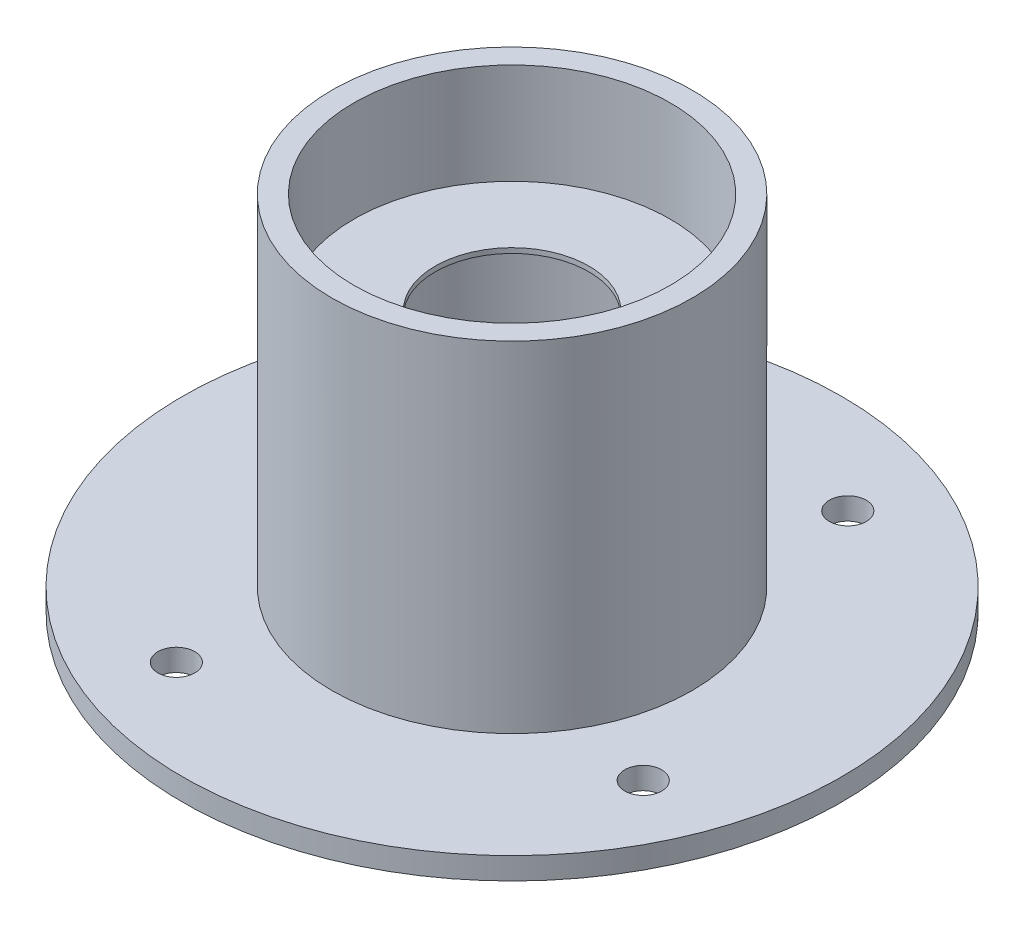
ISO-10303-21;
HEADER;
FILE_DESCRIPTION(('STEP AP214'),'2;1');
FILE_NAME('part.step','',(''),(''),'','','');
FILE_SCHEMA(('AUTOMOTIVE_DESIGN { 1 0 10303 214 1 1 1 1 }'));
ENDSEC;
DATA;
#1=APPLICATION_CONTEXT('core data for automotive mechanical design processes');
#2=APPLICATION_PROTOCOL_DEFINITION('international standard','automotive_design',2000,#1);
#3=PRODUCT_CONTEXT('',#1,'mechanical');
#4=PRODUCT('Part','Part','',(#3));
#5=PRODUCT_RELATED_PRODUCT_CATEGORY('part','',(#4));
#6=PRODUCT_DEFINITION_FORMATION('','',#4);
#7=PRODUCT_DEFINITION_CONTEXT('part definition',#1,'design');
#8=PRODUCT_DEFINITION('design','',#6,#7);
#9=PRODUCT_DEFINITION_SHAPE('','',#8);
#10=(LENGTH_UNIT() NAMED_UNIT(*) SI_UNIT(.MILLI.,.METRE.));
#11=(NAMED_UNIT(*) PLANE_ANGLE_UNIT() SI_UNIT($,.RADIAN.));
#12=(NAMED_UNIT(*) SI_UNIT($,.STERADIAN.) SOLID_ANGLE_UNIT());
#13=UNCERTAINTY_MEASURE_WITH_UNIT(LENGTH_MEASURE(1.E-05),#10,'distance_accuracy_value','');
#14=(GEOMETRIC_REPRESENTATION_CONTEXT(3) GLOBAL_UNCERTAINTY_ASSIGNED_CONTEXT((#13)) GLOBAL_UNIT_ASSIGNED_CONTEXT((#10,
#11,#12)) REPRESENTATION_CONTEXT('',''));
#15=CARTESIAN_POINT('',(0.,0.,0.));
#16=DIRECTION('',(0.,0.,1.));
#17=DIRECTION('',(1.,0.,0.));
#18=AXIS2_PLACEMENT_3D('',#15,#16,#17);
#19=CARTESIAN_POINT('',(0.,7.71111716528533,0.));
#20=DIRECTION('',(0.,1.,0.));
#21=DIRECTION('',(0.,0.,1.));
#22=AXIS2_PLACEMENT_3D('',#19,#20,#21);
#23=CYLINDRICAL_SURFACE('',#22,41.);
#24=CARTESIAN_POINT('',(0.,-53.85,0.));
#25=DIRECTION('',(0.,-1.,0.));
#26=DIRECTION('',(0.,0.,-1.));
#27=AXIS2_PLACEMENT_3D('',#24,#25,#26);
#28=CIRCLE('',#27,41.);
#29=CARTESIAN_POINT('',(0.,-53.85,-41.));
#30=VERTEX_POINT('',#29);
#31=EDGE_CURVE('E61',#30,#30,#28,.T.);
#32=ORIENTED_EDGE('',*,*,#31,.F.);
#33=EDGE_LOOP('',(#32));
#34=FACE_BOUND('',#33,.T.);
#35=CARTESIAN_POINT('',(0.,23.5,0.));
#36=DIRECTION('',(0.,1.,0.));
#37=DIRECTION('',(0.,0.,1.));
#38=AXIS2_PLACEMENT_3D('',#35,#36,#37);
#39=CIRCLE('',#38,41.);
#40=CARTESIAN_POINT('',(0.,23.5,41.));
#41=VERTEX_POINT('',#40);
#42=EDGE_CURVE('E65',#41,#41,#39,.T.);
#43=ORIENTED_EDGE('',*,*,#42,.F.);
#44=EDGE_LOOP('',(#43));
#45=FACE_BOUND('',#44,.T.);
#46=ADVANCED_FACE('F37',(#34,#45),#23,.T.);
#47=CARTESIAN_POINT('',(0.,7.71111716528533,0.));
#48=DIRECTION('',(0.,1.,0.));
#49=DIRECTION('',(0.,0.,1.));
#50=AXIS2_PLACEMENT_3D('',#47,#48,#49);
#51=CYLINDRICAL_SURFACE('',#50,36.);
#52=CARTESIAN_POINT('',(0.,0.57,0.));
#53=DIRECTION('',(0.,1.,0.));
#54=DIRECTION('',(0.,0.,1.));
#55=AXIS2_PLACEMENT_3D('',#52,#53,#54);
#56=CIRCLE('',#55,36.);
#57=CARTESIAN_POINT('',(0.,0.57,36.));
#58=VERTEX_POINT('',#57);
#59=EDGE_CURVE('E55',#58,#58,#56,.T.);
#60=ORIENTED_EDGE('',*,*,#59,.F.);
#61=EDGE_LOOP('',(#60));
#62=FACE_BOUND('',#61,.T.);
#63=CARTESIAN_POINT('',(0.,23.5,0.));
#64=DIRECTION('',(0.,1.,0.));
#65=DIRECTION('',(0.,0.,1.));
#66=AXIS2_PLACEMENT_3D('',#63,#64,#65);
#67=CIRCLE('',#66,36.);
#68=CARTESIAN_POINT('',(0.,23.5,36.));
#69=VERTEX_POINT('',#68);
#70=EDGE_CURVE('E69',#69,#69,#67,.T.);
#71=ORIENTED_EDGE('',*,*,#70,.T.);
#72=EDGE_LOOP('',(#71));
#73=FACE_BOUND('',#72,.T.);
#74=ADVANCED_FACE('F156',(#62,#73),#51,.F.);
#75=CARTESIAN_POINT('',(-36.,0.57,0.));
#76=DIRECTION('',(0.,1.,0.));
#77=DIRECTION('',(0.,0.,1.));
#78=AXIS2_PLACEMENT_3D('',#75,#76,#77);
#79=PLANE('',#78);
#80=ORIENTED_EDGE('',*,*,#59,.T.);
#81=EDGE_LOOP('',(#80));
#82=FACE_BOUND('',#81,.T.);
#83=CARTESIAN_POINT('',(0.,0.57,0.));
#84=DIRECTION('',(0.,1.,0.));
#85=DIRECTION('',(0.,0.,1.));
#86=AXIS2_PLACEMENT_3D('',#83,#84,#85);
#87=CIRCLE('',#86,17.5);
#88=CARTESIAN_POINT('',(0.,0.57,17.5));
#89=VERTEX_POINT('',#88);
#90=EDGE_CURVE('E10',#89,#89,#87,.T.);
#91=ORIENTED_EDGE('',*,*,#90,.F.);
#92=EDGE_LOOP('',(#91));
#93=FACE_BOUND('',#92,.T.);
#94=ADVANCED_FACE('F39',(#82,#93),#79,.T.);
#95=CARTESIAN_POINT('',(0.,7.71111716528533,0.));
#96=DIRECTION('',(0.,1.,0.));
#97=DIRECTION('',(0.,0.,1.));
#98=AXIS2_PLACEMENT_3D('',#95,#96,#97);
#99=CYLINDRICAL_SURFACE('',#98,17.5);
#100=ORIENTED_EDGE('',*,*,#90,.T.);
#101=EDGE_LOOP('',(#100));
#102=FACE_BOUND('',#101,.T.);
#103=CARTESIAN_POINT('',(0.,-0.57,0.));
#104=DIRECTION('',(0.,1.,0.));
#105=DIRECTION('',(0.,0.,1.));
#106=AXIS2_PLACEMENT_3D('',#103,#104,#105);
#107=CIRCLE('',#106,17.5);
#108=CARTESIAN_POINT('',(0.,-0.57,17.5));
#109=VERTEX_POINT('',#108);
#110=EDGE_CURVE('E45',#109,#109,#107,.T.);
#111=ORIENTED_EDGE('',*,*,#110,.F.);
#112=EDGE_LOOP('',(#111));
#113=FACE_BOUND('',#112,.T.);
#114=ADVANCED_FACE('F173',(#102,#113),#99,.F.);
#115=CARTESIAN_POINT('',(-17.5,-0.57,0.));
#116=DIRECTION('',(0.,-1.,0.));
#117=DIRECTION('',(0.,0.,-1.));
#118=AXIS2_PLACEMENT_3D('',#115,#116,#117);
#119=PLANE('',#118);
#120=ORIENTED_EDGE('',*,*,#110,.T.);
#121=EDGE_LOOP('',(#120));
#122=FACE_BOUND('',#121,.T.);
#123=CARTESIAN_POINT('',(0.,-0.57,0.));
#124=DIRECTION('',(0.,1.,0.));
#125=DIRECTION('',(0.,0.,1.));
#126=AXIS2_PLACEMENT_3D('',#123,#124,#125);
#127=CIRCLE('',#126,36.);
#128=CARTESIAN_POINT('',(0.,-0.57,36.));
#129=VERTEX_POINT('',#128);
#130=EDGE_CURVE('E50',#129,#129,#127,.T.);
#131=ORIENTED_EDGE('',*,*,#130,.F.);
#132=EDGE_LOOP('',(#131));
#133=FACE_BOUND('',#132,.T.);
#134=ADVANCED_FACE('F170',(#122,#133),#119,.T.);
#135=CARTESIAN_POINT('',(0.,7.71111716528533,0.));
#136=DIRECTION('',(0.,1.,0.));
#137=DIRECTION('',(0.,0.,1.));
#138=AXIS2_PLACEMENT_3D('',#135,#136,#137);
#139=CYLINDRICAL_SURFACE('',#138,36.);
#140=ORIENTED_EDGE('',*,*,#130,.T.);
#141=EDGE_LOOP('',(#140));
#142=FACE_BOUND('',#141,.T.);
#143=CARTESIAN_POINT('',(0.,-58.85,0.));
#144=DIRECTION('',(0.,-1.,0.));
#145=DIRECTION('',(0.,0.,-1.));
#146=AXIS2_PLACEMENT_3D('',#143,#144,#145);
#147=CIRCLE('',#146,36.);
#148=CARTESIAN_POINT('',(0.,-58.85,-36.));
#149=VERTEX_POINT('',#148);
#150=EDGE_CURVE('E78',#149,#149,#147,.T.);
#151=ORIENTED_EDGE('',*,*,#150,.T.);
#152=EDGE_LOOP('',(#151));
#153=FACE_BOUND('',#152,.T.);
#154=ADVANCED_FACE('F166',(#142,#153),#139,.F.);
#155=CARTESIAN_POINT('',(0.,23.5,0.));
#156=DIRECTION('',(0.,1.,0.));
#157=DIRECTION('',(0.,0.,1.));
#158=AXIS2_PLACEMENT_3D('',#155,#156,#157);
#159=PLANE('',#158);
#160=ORIENTED_EDGE('',*,*,#70,.F.);
#161=EDGE_LOOP('',(#160));
#162=FACE_BOUND('',#161,.T.);
#163=ORIENTED_EDGE('',*,*,#42,.T.);
#164=EDGE_LOOP('',(#163));
#165=FACE_BOUND('',#164,.T.);
#166=ADVANCED_FACE('F169',(#162,#165),#159,.T.);
#167=CARTESIAN_POINT('',(0.,-58.85,0.));
#168=DIRECTION('',(0.,-1.,0.));
#169=DIRECTION('',(0.,0.,-1.));
#170=AXIS2_PLACEMENT_3D('',#167,#168,#169);
#171=PLANE('',#170);
#172=CARTESIAN_POINT('',(-23.2775301449336,-58.85,53.1239737816337));
#173=DIRECTION('',(0.,1.,0.));
#174=DIRECTION('',(-1.,0.,0.));
#175=AXIS2_PLACEMENT_3D('',#172,#173,#174);
#176=CIRCLE('',#175,4.2);
#177=CARTESIAN_POINT('',(-27.4775301449336,-58.85,53.1239737816337));
#178=VERTEX_POINT('',#177);
#179=EDGE_CURVE('E107',#178,#178,#176,.T.);
#180=ORIENTED_EDGE('',*,*,#179,.T.);
#181=EDGE_LOOP('',(#180));
#182=FACE_BOUND('',#181,.T.);
#183=CARTESIAN_POINT('',(-53.1239737816338,-58.85,-23.2775301449335));
#184=DIRECTION('',(0.,1.,0.));
#185=DIRECTION('',(0.,0.,-1.));
#186=AXIS2_PLACEMENT_3D('',#183,#184,#185);
#187=CIRCLE('',#186,4.2);
#188=CARTESIAN_POINT('',(-53.1239737816338,-58.85,-27.4775301449335));
#189=VERTEX_POINT('',#188);
#190=EDGE_CURVE('E98',#189,#189,#187,.T.);
#191=ORIENTED_EDGE('',*,*,#190,.T.);
#192=EDGE_LOOP('',(#191));
#193=FACE_BOUND('',#192,.T.);
#194=CARTESIAN_POINT('',(23.277530144934,-58.85,-53.1239737816335));
#195=DIRECTION('',(0.,1.,0.));
#196=DIRECTION('',(1.,0.,0.));
#197=AXIS2_PLACEMENT_3D('',#194,#195,#196);
#198=CIRCLE('',#197,4.2);
#199=CARTESIAN_POINT('',(27.477530144934,-58.85,-53.1239737816335));
#200=VERTEX_POINT('',#199);
#201=EDGE_CURVE('E99',#200,#200,#198,.T.);
#202=ORIENTED_EDGE('',*,*,#201,.T.);
#203=EDGE_LOOP('',(#202));
#204=FACE_BOUND('',#203,.T.);
#205=CARTESIAN_POINT('',(53.1239737816338,-58.85,23.2775301449335));
#206=DIRECTION('',(0.,1.,0.));
#207=DIRECTION('',(0.,0.,1.));
#208=AXIS2_PLACEMENT_3D('',#205,#206,#207);
#209=CIRCLE('',#208,4.2);
#210=CARTESIAN_POINT('',(53.1239737816338,-58.85,27.4775301449335));
#211=VERTEX_POINT('',#210);
#212=EDGE_CURVE('E85',#211,#211,#209,.T.);
#213=ORIENTED_EDGE('',*,*,#212,.T.);
#214=EDGE_LOOP('',(#213));
#215=FACE_BOUND('',#214,.T.);
#216=CARTESIAN_POINT('',(0.,-58.85,0.));
#217=DIRECTION('',(0.,-1.,0.));
#218=DIRECTION('',(0.,0.,-1.));
#219=AXIS2_PLACEMENT_3D('',#216,#217,#218);
#220=CIRCLE('',#219,75.);
#221=CARTESIAN_POINT('',(0.,-58.85,-75.));
#222=VERTEX_POINT('',#221);
#223=EDGE_CURVE('E73',#222,#222,#220,.T.);
#224=ORIENTED_EDGE('',*,*,#223,.T.);
#225=EDGE_LOOP('',(#224));
#226=FACE_BOUND('',#225,.T.);
#227=ORIENTED_EDGE('',*,*,#150,.F.);
#228=EDGE_LOOP('',(#227));
#229=FACE_BOUND('',#228,.T.);
#230=ADVANCED_FACE('F118',(#182,#193,#204,#215,#226,#229),#171,.T.);
#231=CARTESIAN_POINT('',(0.,-53.85,0.));
#232=DIRECTION('',(0.,-1.,0.));
#233=DIRECTION('',(0.,0.,-1.));
#234=AXIS2_PLACEMENT_3D('',#231,#232,#233);
#235=PLANE('',#234);
#236=CARTESIAN_POINT('',(-23.2775301449336,-53.85,53.1239737816337));
#237=DIRECTION('',(0.,1.,0.));
#238=DIRECTION('',(-1.,0.,0.));
#239=AXIS2_PLACEMENT_3D('',#236,#237,#238);
#240=CIRCLE('',#239,4.2);
#241=CARTESIAN_POINT('',(-27.4775301449336,-53.85,53.1239737816337));
#242=VERTEX_POINT('',#241);
#243=EDGE_CURVE('E93',#242,#242,#240,.T.);
#244=ORIENTED_EDGE('',*,*,#243,.F.);
#245=EDGE_LOOP('',(#244));
#246=FACE_BOUND('',#245,.T.);
#247=CARTESIAN_POINT('',(-53.1239737816338,-53.85,-23.2775301449335));
#248=DIRECTION('',(0.,1.,0.));
#249=DIRECTION('',(0.,0.,-1.));
#250=AXIS2_PLACEMENT_3D('',#247,#248,#249);
#251=CIRCLE('',#250,4.2);
#252=CARTESIAN_POINT('',(-53.1239737816338,-53.85,-27.4775301449335));
#253=VERTEX_POINT('',#252);
#254=EDGE_CURVE('E103',#253,#253,#251,.T.);
#255=ORIENTED_EDGE('',*,*,#254,.F.);
#256=EDGE_LOOP('',(#255));
#257=FACE_BOUND('',#256,.T.);
#258=CARTESIAN_POINT('',(23.277530144934,-53.85,-53.1239737816335));
#259=DIRECTION('',(0.,1.,0.));
#260=DIRECTION('',(1.,0.,0.));
#261=AXIS2_PLACEMENT_3D('',#258,#259,#260);
#262=CIRCLE('',#261,4.2);
#263=CARTESIAN_POINT('',(27.477530144934,-53.85,-53.1239737816335));
#264=VERTEX_POINT('',#263);
#265=EDGE_CURVE('E94',#264,#264,#262,.T.);
#266=ORIENTED_EDGE('',*,*,#265,.F.);
#267=EDGE_LOOP('',(#266));
#268=FACE_BOUND('',#267,.T.);
#269=CARTESIAN_POINT('',(53.1239737816338,-53.85,23.2775301449335));
#270=DIRECTION('',(0.,1.,0.));
#271=DIRECTION('',(0.,0.,1.));
#272=AXIS2_PLACEMENT_3D('',#269,#270,#271);
#273=CIRCLE('',#272,4.2);
#274=CARTESIAN_POINT('',(53.1239737816338,-53.85,27.4775301449335));
#275=VERTEX_POINT('',#274);
#276=EDGE_CURVE('E89',#275,#275,#273,.T.);
#277=ORIENTED_EDGE('',*,*,#276,.F.);
#278=EDGE_LOOP('',(#277));
#279=FACE_BOUND('',#278,.T.);
#280=ORIENTED_EDGE('',*,*,#31,.T.);
#281=EDGE_LOOP('',(#280));
#282=FACE_BOUND('',#281,.T.);
#283=CARTESIAN_POINT('',(0.,-53.85,0.));
#284=DIRECTION('',(0.,-1.,0.));
#285=DIRECTION('',(0.,0.,-1.));
#286=AXIS2_PLACEMENT_3D('',#283,#284,#285);
#287=CIRCLE('',#286,75.);
#288=CARTESIAN_POINT('',(0.,-53.85,-75.));
#289=VERTEX_POINT('',#288);
#290=EDGE_CURVE('E74',#289,#289,#287,.T.);
#291=ORIENTED_EDGE('',*,*,#290,.F.);
#292=EDGE_LOOP('',(#291));
#293=FACE_BOUND('',#292,.T.);
#294=ADVANCED_FACE('F128',(#246,#257,#268,#279,#282,#293),#235,.F.);
#295=CARTESIAN_POINT('',(0.,-58.85,0.));
#296=DIRECTION('',(0.,1.,0.));
#297=DIRECTION('',(0.,0.,1.));
#298=AXIS2_PLACEMENT_3D('',#295,#296,#297);
#299=CYLINDRICAL_SURFACE('',#298,75.);
#300=ORIENTED_EDGE('',*,*,#223,.F.);
#301=EDGE_LOOP('',(#300));
#302=FACE_BOUND('',#301,.T.);
#303=ORIENTED_EDGE('',*,*,#290,.T.);
#304=EDGE_LOOP('',(#303));
#305=FACE_BOUND('',#304,.T.);
#306=ADVANCED_FACE('F131',(#302,#305),#299,.T.);
#307=CARTESIAN_POINT('',(53.1239737816338,-53.85,23.2775301449335));
#308=DIRECTION('',(0.,1.,0.));
#309=DIRECTION('',(0.,0.,1.));
#310=AXIS2_PLACEMENT_3D('',#307,#308,#309);
#311=CYLINDRICAL_SURFACE('',#310,4.2);
#312=ORIENTED_EDGE('',*,*,#212,.F.);
#313=EDGE_LOOP('',(#312));
#314=FACE_BOUND('',#313,.T.);
#315=ORIENTED_EDGE('',*,*,#276,.T.);
#316=EDGE_LOOP('',(#315));
#317=FACE_BOUND('',#316,.T.);
#318=ADVANCED_FACE('F144',(#314,#317),#311,.F.);
#319=CARTESIAN_POINT('',(23.277530144934,-53.85,-53.1239737816335));
#320=DIRECTION('',(0.,1.,0.));
#321=DIRECTION('',(1.,0.,0.));
#322=AXIS2_PLACEMENT_3D('',#319,#320,#321);
#323=CYLINDRICAL_SURFACE('',#322,4.2);
#324=ORIENTED_EDGE('',*,*,#201,.F.);
#325=EDGE_LOOP('',(#324));
#326=FACE_BOUND('',#325,.T.);
#327=ORIENTED_EDGE('',*,*,#265,.T.);
#328=EDGE_LOOP('',(#327));
#329=FACE_BOUND('',#328,.T.);
#330=ADVANCED_FACE('F150',(#326,#329),#323,.F.);
#331=CARTESIAN_POINT('',(-53.1239737816338,-53.85,-23.2775301449335));
#332=DIRECTION('',(0.,1.,0.));
#333=DIRECTION('',(0.,0.,-1.));
#334=AXIS2_PLACEMENT_3D('',#331,#332,#333);
#335=CYLINDRICAL_SURFACE('',#334,4.2);
#336=ORIENTED_EDGE('',*,*,#190,.F.);
#337=EDGE_LOOP('',(#336));
#338=FACE_BOUND('',#337,.T.);
#339=ORIENTED_EDGE('',*,*,#254,.T.);
#340=EDGE_LOOP('',(#339));
#341=FACE_BOUND('',#340,.T.);
#342=ADVANCED_FACE('F124',(#338,#341),#335,.F.);
#343=CARTESIAN_POINT('',(-23.2775301449336,-53.85,53.1239737816337));
#344=DIRECTION('',(0.,1.,0.));
#345=DIRECTION('',(-1.,0.,0.));
#346=AXIS2_PLACEMENT_3D('',#343,#344,#345);
#347=CYLINDRICAL_SURFACE('',#346,4.2);
#348=ORIENTED_EDGE('',*,*,#179,.F.);
#349=EDGE_LOOP('',(#348));
#350=FACE_BOUND('',#349,.T.);
#351=ORIENTED_EDGE('',*,*,#243,.T.);
#352=EDGE_LOOP('',(#351));
#353=FACE_BOUND('',#352,.T.);
#354=ADVANCED_FACE('F121',(#350,#353),#347,.F.);
#355=CLOSED_SHELL('',(#46,#74,#94,#114,#134,#154,#166,#230,#294,#306,#318,#330,#342,#354));
#356=MANIFOLD_SOLID_BREP('B2',#355);
#357=ADVANCED_BREP_SHAPE_REPRESENTATION('',(#18,#356),#14);
#358=SHAPE_DEFINITION_REPRESENTATION(#9,#357);
ENDSEC;
END-ISO-10303-21;
